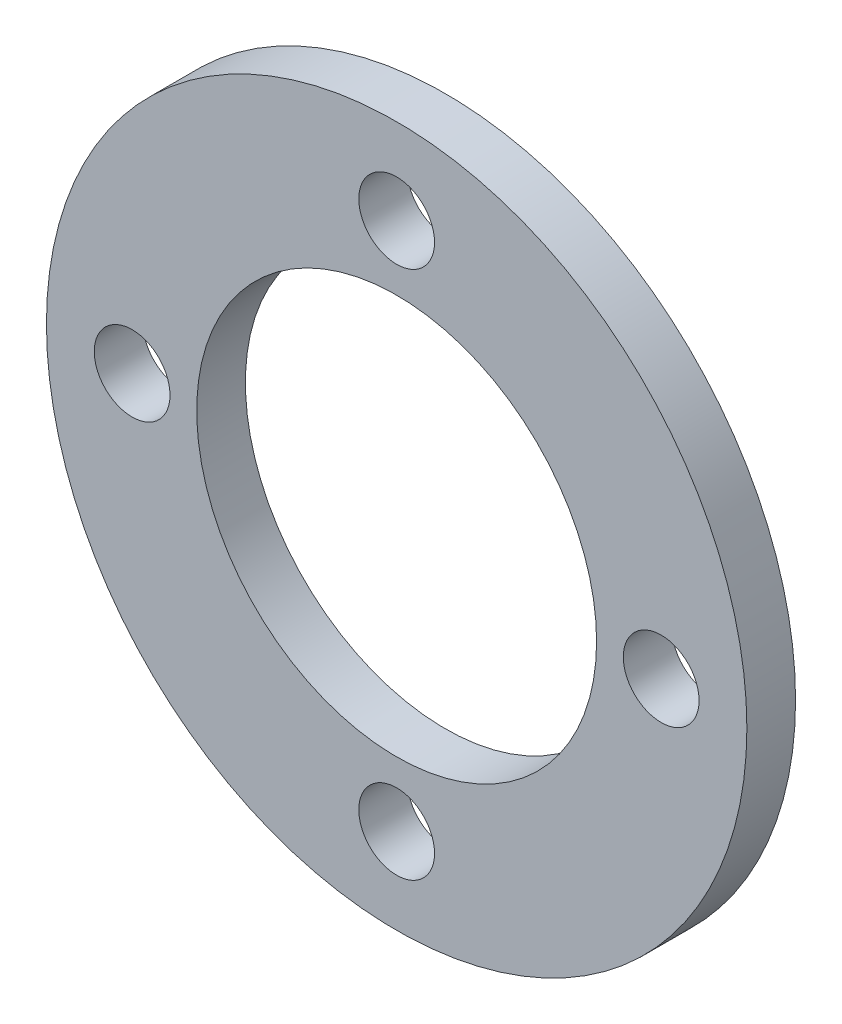
ISO-10303-21;
HEADER;
FILE_DESCRIPTION(('STEP AP214'),'2;1');
FILE_NAME('part.step','',(''),(''),'','','');
FILE_SCHEMA(('AUTOMOTIVE_DESIGN { 1 0 10303 214 1 1 1 1 }'));
ENDSEC;
DATA;
#1=APPLICATION_CONTEXT('core data for automotive mechanical design processes');
#2=APPLICATION_PROTOCOL_DEFINITION('international standard','automotive_design',2000,#1);
#3=PRODUCT_CONTEXT('',#1,'mechanical');
#4=PRODUCT('Part','Part','',(#3));
#5=PRODUCT_RELATED_PRODUCT_CATEGORY('part','',(#4));
#6=PRODUCT_DEFINITION_FORMATION('','',#4);
#7=PRODUCT_DEFINITION_CONTEXT('part definition',#1,'design');
#8=PRODUCT_DEFINITION('design','',#6,#7);
#9=PRODUCT_DEFINITION_SHAPE('','',#8);
#10=(LENGTH_UNIT() NAMED_UNIT(*) SI_UNIT(.MILLI.,.METRE.));
#11=(NAMED_UNIT(*) PLANE_ANGLE_UNIT() SI_UNIT($,.RADIAN.));
#12=(NAMED_UNIT(*) SI_UNIT($,.STERADIAN.) SOLID_ANGLE_UNIT());
#13=UNCERTAINTY_MEASURE_WITH_UNIT(LENGTH_MEASURE(1.E-05),#10,'distance_accuracy_value','');
#14=(GEOMETRIC_REPRESENTATION_CONTEXT(3) GLOBAL_UNCERTAINTY_ASSIGNED_CONTEXT((#13)) GLOBAL_UNIT_ASSIGNED_CONTEXT((#10,
#11,#12)) REPRESENTATION_CONTEXT('',''));
#15=CARTESIAN_POINT('',(0.,0.,0.));
#16=DIRECTION('',(0.,0.,1.));
#17=DIRECTION('',(1.,0.,0.));
#18=AXIS2_PLACEMENT_3D('',#15,#16,#17);
#19=CARTESIAN_POINT('',(0.,0.,1.96));
#20=DIRECTION('',(0.,0.,1.));
#21=DIRECTION('',(1.,0.,0.));
#22=AXIS2_PLACEMENT_3D('',#19,#20,#21);
#23=PLANE('',#22);
#24=CARTESIAN_POINT('',(3.00082707751619E-13,-10.65,1.96));
#25=DIRECTION('',(0.,0.,1.));
#26=DIRECTION('',(1.,0.,0.));
#27=AXIS2_PLACEMENT_3D('',#24,#25,#26);
#28=CIRCLE('',#27,1.52500000000036);
#29=CARTESIAN_POINT('',(1.52500000000066,-10.65,1.96));
#30=VERTEX_POINT('',#29);
#31=EDGE_CURVE('E60',#30,#30,#28,.T.);
#32=ORIENTED_EDGE('',*,*,#31,.F.);
#33=EDGE_LOOP('',(#32));
#34=FACE_BOUND('',#33,.T.);
#35=CARTESIAN_POINT('',(0.,0.,1.96));
#36=DIRECTION('',(0.,0.,1.));
#37=DIRECTION('',(1.,0.,0.));
#38=AXIS2_PLACEMENT_3D('',#35,#36,#37);
#39=CIRCLE('',#38,8.05);
#40=CARTESIAN_POINT('',(8.05,0.,1.96));
#41=VERTEX_POINT('',#40);
#42=EDGE_CURVE('E48',#41,#41,#39,.T.);
#43=ORIENTED_EDGE('',*,*,#42,.F.);
#44=EDGE_LOOP('',(#43));
#45=FACE_BOUND('',#44,.T.);
#46=CARTESIAN_POINT('',(0.,0.,1.96));
#47=DIRECTION('',(0.,0.,1.));
#48=DIRECTION('',(1.,0.,0.));
#49=AXIS2_PLACEMENT_3D('',#46,#47,#48);
#50=CIRCLE('',#49,14.1);
#51=CARTESIAN_POINT('',(14.1,0.,1.96));
#52=VERTEX_POINT('',#51);
#53=EDGE_CURVE('E10',#52,#52,#50,.T.);
#54=ORIENTED_EDGE('',*,*,#53,.T.);
#55=EDGE_LOOP('',(#54));
#56=FACE_BOUND('',#55,.T.);
#57=CARTESIAN_POINT('',(0.,10.65,1.96));
#58=DIRECTION('',(0.,0.,1.));
#59=DIRECTION('',(1.,0.,0.));
#60=AXIS2_PLACEMENT_3D('',#57,#58,#59);
#61=CIRCLE('',#60,1.525);
#62=CARTESIAN_POINT('',(1.525,10.65,1.96));
#63=VERTEX_POINT('',#62);
#64=EDGE_CURVE('E43',#63,#63,#61,.T.);
#65=ORIENTED_EDGE('',*,*,#64,.F.);
#66=EDGE_LOOP('',(#65));
#67=FACE_BOUND('',#66,.T.);
#68=CARTESIAN_POINT('',(10.65,0.,1.96));
#69=DIRECTION('',(0.,0.,1.));
#70=DIRECTION('',(1.,0.,0.));
#71=AXIS2_PLACEMENT_3D('',#68,#69,#70);
#72=CIRCLE('',#71,1.525);
#73=CARTESIAN_POINT('',(12.175,0.,1.96));
#74=VERTEX_POINT('',#73);
#75=EDGE_CURVE('E54',#74,#74,#72,.T.);
#76=ORIENTED_EDGE('',*,*,#75,.F.);
#77=EDGE_LOOP('',(#76));
#78=FACE_BOUND('',#77,.T.);
#79=CARTESIAN_POINT('',(-10.6499999999999,-1.51345602716901E-13,1.96));
#80=DIRECTION('',(0.,0.,1.));
#81=DIRECTION('',(1.,0.,0.));
#82=AXIS2_PLACEMENT_3D('',#79,#80,#81);
#83=CIRCLE('',#82,1.52500000000029);
#84=CARTESIAN_POINT('',(-9.12499999999956,-1.51345602716901E-13,1.96));
#85=VERTEX_POINT('',#84);
#86=EDGE_CURVE('E66',#85,#85,#83,.T.);
#87=ORIENTED_EDGE('',*,*,#86,.F.);
#88=EDGE_LOOP('',(#87));
#89=FACE_BOUND('',#88,.T.);
#90=ADVANCED_FACE('F32',(#34,#45,#56,#67,#78,#89),#23,.T.);
#91=CARTESIAN_POINT('',(0.,0.,0.));
#92=DIRECTION('',(0.,0.,1.));
#93=DIRECTION('',(1.,0.,0.));
#94=AXIS2_PLACEMENT_3D('',#91,#92,#93);
#95=PLANE('',#94);
#96=CARTESIAN_POINT('',(3.00082707751619E-13,-10.65,0.));
#97=DIRECTION('',(0.,0.,1.));
#98=DIRECTION('',(1.,0.,0.));
#99=AXIS2_PLACEMENT_3D('',#96,#97,#98);
#100=CIRCLE('',#99,1.52500000000036);
#101=CARTESIAN_POINT('',(1.52500000000066,-10.65,0.));
#102=VERTEX_POINT('',#101);
#103=EDGE_CURVE('E63',#102,#102,#100,.T.);
#104=ORIENTED_EDGE('',*,*,#103,.T.);
#105=EDGE_LOOP('',(#104));
#106=FACE_BOUND('',#105,.T.);
#107=CARTESIAN_POINT('',(0.,0.,0.));
#108=DIRECTION('',(0.,0.,1.));
#109=DIRECTION('',(1.,0.,0.));
#110=AXIS2_PLACEMENT_3D('',#107,#108,#109);
#111=CIRCLE('',#110,8.05);
#112=CARTESIAN_POINT('',(8.05,0.,0.));
#113=VERTEX_POINT('',#112);
#114=EDGE_CURVE('E51',#113,#113,#111,.T.);
#115=ORIENTED_EDGE('',*,*,#114,.T.);
#116=EDGE_LOOP('',(#115));
#117=FACE_BOUND('',#116,.T.);
#118=CARTESIAN_POINT('',(0.,0.,0.));
#119=DIRECTION('',(0.,0.,1.));
#120=DIRECTION('',(1.,0.,0.));
#121=AXIS2_PLACEMENT_3D('',#118,#119,#120);
#122=CIRCLE('',#121,14.1);
#123=CARTESIAN_POINT('',(14.1,0.,0.));
#124=VERTEX_POINT('',#123);
#125=EDGE_CURVE('E36',#124,#124,#122,.T.);
#126=ORIENTED_EDGE('',*,*,#125,.F.);
#127=EDGE_LOOP('',(#126));
#128=FACE_BOUND('',#127,.T.);
#129=CARTESIAN_POINT('',(0.,10.65,0.));
#130=DIRECTION('',(0.,0.,1.));
#131=DIRECTION('',(1.,0.,0.));
#132=AXIS2_PLACEMENT_3D('',#129,#130,#131);
#133=CIRCLE('',#132,1.525);
#134=CARTESIAN_POINT('',(1.525,10.65,0.));
#135=VERTEX_POINT('',#134);
#136=EDGE_CURVE('E45',#135,#135,#133,.T.);
#137=ORIENTED_EDGE('',*,*,#136,.T.);
#138=EDGE_LOOP('',(#137));
#139=FACE_BOUND('',#138,.T.);
#140=CARTESIAN_POINT('',(10.65,0.,0.));
#141=DIRECTION('',(0.,0.,1.));
#142=DIRECTION('',(1.,0.,0.));
#143=AXIS2_PLACEMENT_3D('',#140,#141,#142);
#144=CIRCLE('',#143,1.525);
#145=CARTESIAN_POINT('',(12.175,0.,0.));
#146=VERTEX_POINT('',#145);
#147=EDGE_CURVE('E57',#146,#146,#144,.T.);
#148=ORIENTED_EDGE('',*,*,#147,.T.);
#149=EDGE_LOOP('',(#148));
#150=FACE_BOUND('',#149,.T.);
#151=CARTESIAN_POINT('',(-10.6499999999999,-1.51345602716901E-13,0.));
#152=DIRECTION('',(0.,0.,1.));
#153=DIRECTION('',(1.,0.,0.));
#154=AXIS2_PLACEMENT_3D('',#151,#152,#153);
#155=CIRCLE('',#154,1.52500000000029);
#156=CARTESIAN_POINT('',(-9.12499999999956,-1.51345602716901E-13,0.));
#157=VERTEX_POINT('',#156);
#158=EDGE_CURVE('E69',#157,#157,#155,.T.);
#159=ORIENTED_EDGE('',*,*,#158,.T.);
#160=EDGE_LOOP('',(#159));
#161=FACE_BOUND('',#160,.T.);
#162=ADVANCED_FACE('F79',(#106,#117,#128,#139,#150,#161),#95,.F.);
#163=CARTESIAN_POINT('',(0.,0.,1.96));
#164=DIRECTION('',(0.,0.,-1.));
#165=DIRECTION('',(-1.,0.,0.));
#166=AXIS2_PLACEMENT_3D('',#163,#164,#165);
#167=CYLINDRICAL_SURFACE('',#166,14.1);
#168=ORIENTED_EDGE('',*,*,#53,.F.);
#169=EDGE_LOOP('',(#168));
#170=FACE_BOUND('',#169,.T.);
#171=ORIENTED_EDGE('',*,*,#125,.T.);
#172=EDGE_LOOP('',(#171));
#173=FACE_BOUND('',#172,.T.);
#174=ADVANCED_FACE('F34',(#170,#173),#167,.T.);
#175=CARTESIAN_POINT('',(0.,10.65,1.96));
#176=DIRECTION('',(0.,0.,-1.));
#177=DIRECTION('',(-1.,0.,0.));
#178=AXIS2_PLACEMENT_3D('',#175,#176,#177);
#179=CYLINDRICAL_SURFACE('',#178,1.525);
#180=ORIENTED_EDGE('',*,*,#64,.T.);
#181=EDGE_LOOP('',(#180));
#182=FACE_BOUND('',#181,.T.);
#183=ORIENTED_EDGE('',*,*,#136,.F.);
#184=EDGE_LOOP('',(#183));
#185=FACE_BOUND('',#184,.T.);
#186=ADVANCED_FACE('F89',(#182,#185),#179,.F.);
#187=CARTESIAN_POINT('',(0.,0.,1.96));
#188=DIRECTION('',(0.,0.,-1.));
#189=DIRECTION('',(-1.,0.,0.));
#190=AXIS2_PLACEMENT_3D('',#187,#188,#189);
#191=CYLINDRICAL_SURFACE('',#190,8.05);
#192=ORIENTED_EDGE('',*,*,#42,.T.);
#193=EDGE_LOOP('',(#192));
#194=FACE_BOUND('',#193,.T.);
#195=ORIENTED_EDGE('',*,*,#114,.F.);
#196=EDGE_LOOP('',(#195));
#197=FACE_BOUND('',#196,.T.);
#198=ADVANCED_FACE('F92',(#194,#197),#191,.F.);
#199=CARTESIAN_POINT('',(10.65,0.,1.96));
#200=DIRECTION('',(0.,0.,-1.));
#201=DIRECTION('',(-1.,0.,0.));
#202=AXIS2_PLACEMENT_3D('',#199,#200,#201);
#203=CYLINDRICAL_SURFACE('',#202,1.525);
#204=ORIENTED_EDGE('',*,*,#75,.T.);
#205=EDGE_LOOP('',(#204));
#206=FACE_BOUND('',#205,.T.);
#207=ORIENTED_EDGE('',*,*,#147,.F.);
#208=EDGE_LOOP('',(#207));
#209=FACE_BOUND('',#208,.T.);
#210=ADVANCED_FACE('F96',(#206,#209),#203,.F.);
#211=CARTESIAN_POINT('',(3.00082707751619E-13,-10.65,1.96));
#212=DIRECTION('',(0.,0.,-1.));
#213=DIRECTION('',(-1.,0.,0.));
#214=AXIS2_PLACEMENT_3D('',#211,#212,#213);
#215=CYLINDRICAL_SURFACE('',#214,1.52500000000036);
#216=ORIENTED_EDGE('',*,*,#31,.T.);
#217=EDGE_LOOP('',(#216));
#218=FACE_BOUND('',#217,.T.);
#219=ORIENTED_EDGE('',*,*,#103,.F.);
#220=EDGE_LOOP('',(#219));
#221=FACE_BOUND('',#220,.T.);
#222=ADVANCED_FACE('F100',(#218,#221),#215,.F.);
#223=CARTESIAN_POINT('',(-10.6499999999999,-1.51345602716901E-13,1.96));
#224=DIRECTION('',(0.,0.,-1.));
#225=DIRECTION('',(-1.,0.,0.));
#226=AXIS2_PLACEMENT_3D('',#223,#224,#225);
#227=CYLINDRICAL_SURFACE('',#226,1.52500000000029);
#228=ORIENTED_EDGE('',*,*,#86,.T.);
#229=EDGE_LOOP('',(#228));
#230=FACE_BOUND('',#229,.T.);
#231=ORIENTED_EDGE('',*,*,#158,.F.);
#232=EDGE_LOOP('',(#231));
#233=FACE_BOUND('',#232,.T.);
#234=ADVANCED_FACE('F75',(#230,#233),#227,.F.);
#235=CLOSED_SHELL('',(#90,#162,#174,#186,#198,#210,#222,#234));
#236=MANIFOLD_SOLID_BREP('B2',#235);
#237=ADVANCED_BREP_SHAPE_REPRESENTATION('',(#18,#236),#14);
#238=SHAPE_DEFINITION_REPRESENTATION(#9,#237);
ENDSEC;
END-ISO-10303-21;
